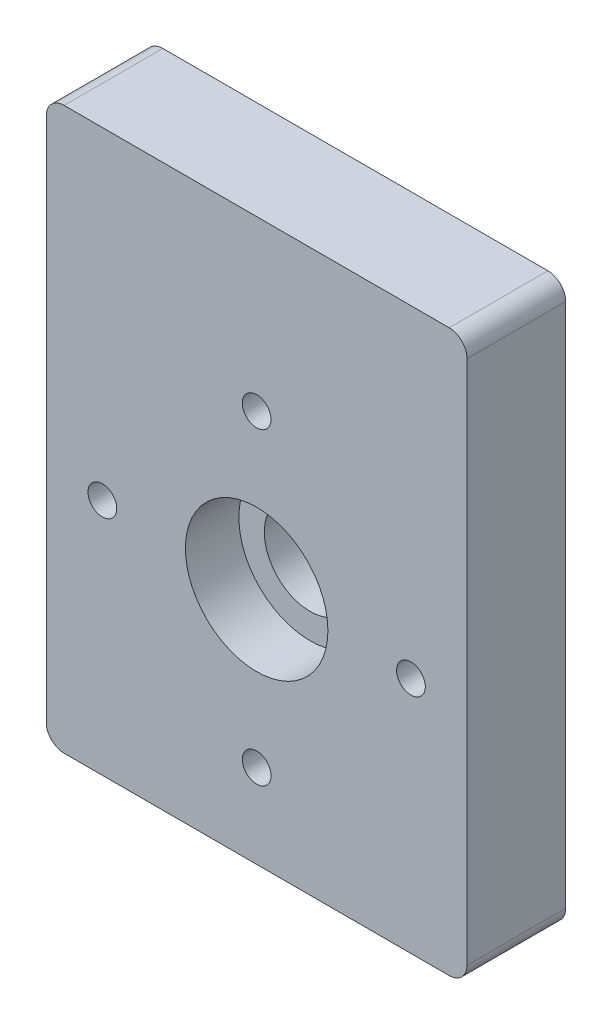
ISO-10303-21;
HEADER;
FILE_DESCRIPTION(('STEP AP214'),'2;1');
FILE_NAME('part.step','',(''),(''),'','','');
FILE_SCHEMA(('AUTOMOTIVE_DESIGN { 1 0 10303 214 1 1 1 1 }'));
ENDSEC;
DATA;
#1=APPLICATION_CONTEXT('core data for automotive mechanical design processes');
#2=APPLICATION_PROTOCOL_DEFINITION('international standard','automotive_design',2000,#1);
#3=PRODUCT_CONTEXT('',#1,'mechanical');
#4=PRODUCT('Part','Part','',(#3));
#5=PRODUCT_RELATED_PRODUCT_CATEGORY('part','',(#4));
#6=PRODUCT_DEFINITION_FORMATION('','',#4);
#7=PRODUCT_DEFINITION_CONTEXT('part definition',#1,'design');
#8=PRODUCT_DEFINITION('design','',#6,#7);
#9=PRODUCT_DEFINITION_SHAPE('','',#8);
#10=(LENGTH_UNIT() NAMED_UNIT(*) SI_UNIT(.MILLI.,.METRE.));
#11=(NAMED_UNIT(*) PLANE_ANGLE_UNIT() SI_UNIT($,.RADIAN.));
#12=(NAMED_UNIT(*) SI_UNIT($,.STERADIAN.) SOLID_ANGLE_UNIT());
#13=UNCERTAINTY_MEASURE_WITH_UNIT(LENGTH_MEASURE(1.E-05),#10,'distance_accuracy_value','');
#14=(GEOMETRIC_REPRESENTATION_CONTEXT(3) GLOBAL_UNCERTAINTY_ASSIGNED_CONTEXT((#13)) GLOBAL_UNIT_ASSIGNED_CONTEXT((#10,
#11,#12)) REPRESENTATION_CONTEXT('',''));
#15=CARTESIAN_POINT('',(0.,0.,0.));
#16=DIRECTION('',(0.,0.,1.));
#17=DIRECTION('',(1.,0.,0.));
#18=AXIS2_PLACEMENT_3D('',#15,#16,#17);
#19=CARTESIAN_POINT('',(0.,0.,7.0358));
#20=DIRECTION('',(1.,0.,0.));
#21=DIRECTION('',(0.,0.,-1.));
#22=AXIS2_PLACEMENT_3D('',#19,#20,#21);
#23=PLANE('',#22);
#24=DIRECTION('',(0.,-1.,0.));
#25=VECTOR('',#24,1.);
#26=CARTESIAN_POINT('',(0.,0.,0.));
#27=LINE('',#26,#25);
#28=CARTESIAN_POINT('',(0.,38.73,0.));
#29=VERTEX_POINT('',#28);
#30=CARTESIAN_POINT('',(0.,1.27,0.));
#31=VERTEX_POINT('',#30);
#32=EDGE_CURVE('E129',#29,#31,#27,.T.);
#33=ORIENTED_EDGE('',*,*,#32,.T.);
#34=DIRECTION('',(0.,0.,-1.));
#35=VECTOR('',#34,1.);
#36=CARTESIAN_POINT('',(0.,1.27,7.0358));
#37=LINE('',#36,#35);
#38=CARTESIAN_POINT('',(0.,1.27,7.0358));
#39=VERTEX_POINT('',#38);
#40=EDGE_CURVE('E152',#31,#39,#37,.F.);
#41=ORIENTED_EDGE('',*,*,#40,.T.);
#42=DIRECTION('',(0.,-1.,0.));
#43=VECTOR('',#42,1.);
#44=CARTESIAN_POINT('',(0.,0.,7.0358));
#45=LINE('',#44,#43);
#46=CARTESIAN_POINT('',(0.,38.73,7.0358));
#47=VERTEX_POINT('',#46);
#48=EDGE_CURVE('E127',#47,#39,#45,.T.);
#49=ORIENTED_EDGE('',*,*,#48,.F.);
#50=DIRECTION('',(0.,0.,-1.));
#51=VECTOR('',#50,1.);
#52=CARTESIAN_POINT('',(0.,38.73,7.0358));
#53=LINE('',#52,#51);
#54=EDGE_CURVE('E149',#47,#29,#53,.T.);
#55=ORIENTED_EDGE('',*,*,#54,.T.);
#56=EDGE_LOOP('',(#33,#41,#49,#55));
#57=FACE_BOUND('',#56,.T.);
#58=ADVANCED_FACE('F34',(#57),#23,.F.);
#59=CARTESIAN_POINT('',(0.,0.,7.0358));
#60=DIRECTION('',(0.,1.,0.));
#61=DIRECTION('',(0.,0.,1.));
#62=AXIS2_PLACEMENT_3D('',#59,#60,#61);
#63=PLANE('',#62);
#64=DIRECTION('',(1.,0.,0.));
#65=VECTOR('',#64,1.);
#66=CARTESIAN_POINT('',(0.,0.,0.));
#67=LINE('',#66,#65);
#68=CARTESIAN_POINT('',(1.27,0.,0.));
#69=VERTEX_POINT('',#68);
#70=CARTESIAN_POINT('',(28.73,0.,0.));
#71=VERTEX_POINT('',#70);
#72=EDGE_CURVE('E125',#69,#71,#67,.T.);
#73=ORIENTED_EDGE('',*,*,#72,.T.);
#74=DIRECTION('',(0.,0.,-1.));
#75=VECTOR('',#74,1.);
#76=CARTESIAN_POINT('',(28.73,0.,7.0358));
#77=LINE('',#76,#75);
#78=CARTESIAN_POINT('',(28.73,0.,7.0358));
#79=VERTEX_POINT('',#78);
#80=EDGE_CURVE('E104',#71,#79,#77,.F.);
#81=ORIENTED_EDGE('',*,*,#80,.T.);
#82=DIRECTION('',(1.,0.,0.));
#83=VECTOR('',#82,1.);
#84=CARTESIAN_POINT('',(0.,0.,7.0358));
#85=LINE('',#84,#83);
#86=CARTESIAN_POINT('',(1.27,0.,7.0358));
#87=VERTEX_POINT('',#86);
#88=EDGE_CURVE('E168',#87,#79,#85,.T.);
#89=ORIENTED_EDGE('',*,*,#88,.F.);
#90=DIRECTION('',(0.,0.,-1.));
#91=VECTOR('',#90,1.);
#92=CARTESIAN_POINT('',(1.27,0.,7.0358));
#93=LINE('',#92,#91);
#94=EDGE_CURVE('E109',#87,#69,#93,.T.);
#95=ORIENTED_EDGE('',*,*,#94,.T.);
#96=EDGE_LOOP('',(#73,#81,#89,#95));
#97=FACE_BOUND('',#96,.T.);
#98=ADVANCED_FACE('F231',(#97),#63,.F.);
#99=CARTESIAN_POINT('',(30.,0.,7.0358));
#100=DIRECTION('',(-1.,0.,0.));
#101=DIRECTION('',(0.,0.,1.));
#102=AXIS2_PLACEMENT_3D('',#99,#100,#101);
#103=PLANE('',#102);
#104=DIRECTION('',(0.,1.,0.));
#105=VECTOR('',#104,1.);
#106=CARTESIAN_POINT('',(30.,0.,7.0358));
#107=LINE('',#106,#105);
#108=CARTESIAN_POINT('',(30.,1.27,7.0358));
#109=VERTEX_POINT('',#108);
#110=CARTESIAN_POINT('',(30.,38.73,7.0358));
#111=VERTEX_POINT('',#110);
#112=EDGE_CURVE('E118',#109,#111,#107,.T.);
#113=ORIENTED_EDGE('',*,*,#112,.F.);
#114=DIRECTION('',(0.,0.,-1.));
#115=VECTOR('',#114,1.);
#116=CARTESIAN_POINT('',(30.,1.27,7.0358));
#117=LINE('',#116,#115);
#118=CARTESIAN_POINT('',(30.,1.27,0.));
#119=VERTEX_POINT('',#118);
#120=EDGE_CURVE('E103',#109,#119,#117,.T.);
#121=ORIENTED_EDGE('',*,*,#120,.T.);
#122=DIRECTION('',(0.,1.,0.));
#123=VECTOR('',#122,1.);
#124=CARTESIAN_POINT('',(30.,0.,0.));
#125=LINE('',#124,#123);
#126=CARTESIAN_POINT('',(30.,38.73,0.));
#127=VERTEX_POINT('',#126);
#128=EDGE_CURVE('E116',#119,#127,#125,.T.);
#129=ORIENTED_EDGE('',*,*,#128,.T.);
#130=DIRECTION('',(0.,0.,-1.));
#131=VECTOR('',#130,1.);
#132=CARTESIAN_POINT('',(30.,38.73,7.0358));
#133=LINE('',#132,#131);
#134=EDGE_CURVE('E120',#127,#111,#133,.F.);
#135=ORIENTED_EDGE('',*,*,#134,.T.);
#136=EDGE_LOOP('',(#113,#121,#129,#135));
#137=FACE_BOUND('',#136,.T.);
#138=ADVANCED_FACE('F115',(#137),#103,.F.);
#139=CARTESIAN_POINT('',(0.,40.,7.0358));
#140=DIRECTION('',(0.,-1.,0.));
#141=DIRECTION('',(0.,0.,-1.));
#142=AXIS2_PLACEMENT_3D('',#139,#140,#141);
#143=PLANE('',#142);
#144=DIRECTION('',(-1.,0.,0.));
#145=VECTOR('',#144,1.);
#146=CARTESIAN_POINT('',(0.,40.,0.));
#147=LINE('',#146,#145);
#148=CARTESIAN_POINT('',(28.73,40.,0.));
#149=VERTEX_POINT('',#148);
#150=CARTESIAN_POINT('',(1.27,40.,0.));
#151=VERTEX_POINT('',#150);
#152=EDGE_CURVE('E124',#149,#151,#147,.T.);
#153=ORIENTED_EDGE('',*,*,#152,.T.);
#154=DIRECTION('',(0.,0.,-1.));
#155=VECTOR('',#154,1.);
#156=CARTESIAN_POINT('',(1.27,40.,7.0358));
#157=LINE('',#156,#155);
#158=CARTESIAN_POINT('',(1.27,40.,7.0358));
#159=VERTEX_POINT('',#158);
#160=EDGE_CURVE('E11',#151,#159,#157,.F.);
#161=ORIENTED_EDGE('',*,*,#160,.T.);
#162=DIRECTION('',(-1.,0.,0.));
#163=VECTOR('',#162,1.);
#164=CARTESIAN_POINT('',(0.,40.,7.0358));
#165=LINE('',#164,#163);
#166=CARTESIAN_POINT('',(28.73,40.,7.0358));
#167=VERTEX_POINT('',#166);
#168=EDGE_CURVE('E133',#167,#159,#165,.T.);
#169=ORIENTED_EDGE('',*,*,#168,.F.);
#170=DIRECTION('',(0.,0.,-1.));
#171=VECTOR('',#170,1.);
#172=CARTESIAN_POINT('',(28.73,40.,7.0358));
#173=LINE('',#172,#171);
#174=EDGE_CURVE('E42',#167,#149,#173,.T.);
#175=ORIENTED_EDGE('',*,*,#174,.T.);
#176=EDGE_LOOP('',(#153,#161,#169,#175));
#177=FACE_BOUND('',#176,.T.);
#178=ADVANCED_FACE('F155',(#177),#143,.F.);
#179=CARTESIAN_POINT('',(0.,0.,7.0358));
#180=DIRECTION('',(0.,0.,-1.));
#181=DIRECTION('',(-1.,0.,0.));
#182=AXIS2_PLACEMENT_3D('',#179,#180,#181);
#183=PLANE('',#182);
#184=CARTESIAN_POINT('',(15.,16.98,7.0358));
#185=DIRECTION('',(0.,0.,1.));
#186=DIRECTION('',(1.,0.,0.));
#187=AXIS2_PLACEMENT_3D('',#184,#185,#186);
#188=CIRCLE('',#187,5.08);
#189=CARTESIAN_POINT('',(20.08,16.98,7.0358));
#190=VERTEX_POINT('',#189);
#191=EDGE_CURVE('E212',#190,#190,#188,.T.);
#192=ORIENTED_EDGE('',*,*,#191,.F.);
#193=EDGE_LOOP('',(#192));
#194=FACE_BOUND('',#193,.T.);
#195=CARTESIAN_POINT('',(15.,27.98,7.0358));
#196=DIRECTION('',(0.,0.,1.));
#197=DIRECTION('',(1.,0.,0.));
#198=AXIS2_PLACEMENT_3D('',#195,#196,#197);
#199=CIRCLE('',#198,1.025);
#200=CARTESIAN_POINT('',(16.025,27.98,7.0358));
#201=VERTEX_POINT('',#200);
#202=EDGE_CURVE('E200',#201,#201,#199,.T.);
#203=ORIENTED_EDGE('',*,*,#202,.F.);
#204=EDGE_LOOP('',(#203));
#205=FACE_BOUND('',#204,.T.);
#206=CARTESIAN_POINT('',(26.,16.98,7.0358));
#207=DIRECTION('',(0.,0.,1.));
#208=DIRECTION('',(1.,0.,0.));
#209=AXIS2_PLACEMENT_3D('',#206,#207,#208);
#210=CIRCLE('',#209,1.025);
#211=CARTESIAN_POINT('',(27.025,16.98,7.0358));
#212=VERTEX_POINT('',#211);
#213=EDGE_CURVE('E194',#212,#212,#210,.T.);
#214=ORIENTED_EDGE('',*,*,#213,.F.);
#215=EDGE_LOOP('',(#214));
#216=FACE_BOUND('',#215,.T.);
#217=CARTESIAN_POINT('',(15.,5.98,7.0358));
#218=DIRECTION('',(0.,0.,1.));
#219=DIRECTION('',(1.,0.,0.));
#220=AXIS2_PLACEMENT_3D('',#217,#218,#219);
#221=CIRCLE('',#220,1.025);
#222=CARTESIAN_POINT('',(16.025,5.98,7.0358));
#223=VERTEX_POINT('',#222);
#224=EDGE_CURVE('E186',#223,#223,#221,.T.);
#225=ORIENTED_EDGE('',*,*,#224,.F.);
#226=EDGE_LOOP('',(#225));
#227=FACE_BOUND('',#226,.T.);
#228=CARTESIAN_POINT('',(4.,16.98,7.0358));
#229=DIRECTION('',(0.,0.,1.));
#230=DIRECTION('',(1.,0.,0.));
#231=AXIS2_PLACEMENT_3D('',#228,#229,#230);
#232=CIRCLE('',#231,1.025);
#233=CARTESIAN_POINT('',(5.025,16.98,7.0358));
#234=VERTEX_POINT('',#233);
#235=EDGE_CURVE('E178',#234,#234,#232,.T.);
#236=ORIENTED_EDGE('',*,*,#235,.F.);
#237=EDGE_LOOP('',(#236));
#238=FACE_BOUND('',#237,.T.);
#239=ORIENTED_EDGE('',*,*,#88,.T.);
#240=CARTESIAN_POINT('',(28.73,1.27,7.0358));
#241=DIRECTION('',(0.,0.,-1.));
#242=DIRECTION('',(-1.,0.,0.));
#243=AXIS2_PLACEMENT_3D('',#240,#241,#242);
#244=CIRCLE('',#243,1.27);
#245=EDGE_CURVE('E147',#79,#109,#244,.F.);
#246=ORIENTED_EDGE('',*,*,#245,.T.);
#247=ORIENTED_EDGE('',*,*,#112,.T.);
#248=CARTESIAN_POINT('',(28.73,38.73,7.0358));
#249=DIRECTION('',(0.,0.,-1.));
#250=DIRECTION('',(-1.,0.,0.));
#251=AXIS2_PLACEMENT_3D('',#248,#249,#250);
#252=CIRCLE('',#251,1.27);
#253=EDGE_CURVE('E54',#111,#167,#252,.F.);
#254=ORIENTED_EDGE('',*,*,#253,.T.);
#255=ORIENTED_EDGE('',*,*,#168,.T.);
#256=CARTESIAN_POINT('',(1.27,38.73,7.0358));
#257=DIRECTION('',(0.,0.,-1.));
#258=DIRECTION('',(-1.,0.,0.));
#259=AXIS2_PLACEMENT_3D('',#256,#257,#258);
#260=CIRCLE('',#259,1.27);
#261=EDGE_CURVE('E143',#159,#47,#260,.F.);
#262=ORIENTED_EDGE('',*,*,#261,.T.);
#263=ORIENTED_EDGE('',*,*,#48,.T.);
#264=CARTESIAN_POINT('',(1.27,1.27,7.0358));
#265=DIRECTION('',(0.,0.,-1.));
#266=DIRECTION('',(-1.,0.,0.));
#267=AXIS2_PLACEMENT_3D('',#264,#265,#266);
#268=CIRCLE('',#267,1.27);
#269=EDGE_CURVE('E145',#39,#87,#268,.F.);
#270=ORIENTED_EDGE('',*,*,#269,.T.);
#271=EDGE_LOOP('',(#239,#246,#247,#254,#255,#262,#263,#270));
#272=FACE_BOUND('',#271,.T.);
#273=ADVANCED_FACE('F218',(#194,#205,#216,#227,#238,#272),#183,.F.);
#274=CARTESIAN_POINT('',(0.,0.,0.));
#275=DIRECTION('',(0.,0.,-1.));
#276=DIRECTION('',(-1.,0.,0.));
#277=AXIS2_PLACEMENT_3D('',#274,#275,#276);
#278=PLANE('',#277);
#279=CARTESIAN_POINT('',(15.,16.98,0.));
#280=DIRECTION('',(0.,0.,1.));
#281=DIRECTION('',(1.,0.,0.));
#282=AXIS2_PLACEMENT_3D('',#279,#280,#281);
#283=CIRCLE('',#282,3.2639);
#284=CARTESIAN_POINT('',(18.2639,16.98,0.));
#285=VERTEX_POINT('',#284);
#286=EDGE_CURVE('E203',#285,#285,#283,.T.);
#287=ORIENTED_EDGE('',*,*,#286,.T.);
#288=EDGE_LOOP('',(#287));
#289=FACE_BOUND('',#288,.T.);
#290=CARTESIAN_POINT('',(15.,27.98,0.));
#291=DIRECTION('',(0.,0.,1.));
#292=DIRECTION('',(1.,0.,0.));
#293=AXIS2_PLACEMENT_3D('',#290,#291,#292);
#294=CIRCLE('',#293,1.025);
#295=CARTESIAN_POINT('',(16.025,27.98,0.));
#296=VERTEX_POINT('',#295);
#297=EDGE_CURVE('E197',#296,#296,#294,.T.);
#298=ORIENTED_EDGE('',*,*,#297,.T.);
#299=EDGE_LOOP('',(#298));
#300=FACE_BOUND('',#299,.T.);
#301=CARTESIAN_POINT('',(26.,16.98,0.));
#302=DIRECTION('',(0.,0.,1.));
#303=DIRECTION('',(1.,0.,0.));
#304=AXIS2_PLACEMENT_3D('',#301,#302,#303);
#305=CIRCLE('',#304,1.025);
#306=CARTESIAN_POINT('',(27.025,16.98,0.));
#307=VERTEX_POINT('',#306);
#308=EDGE_CURVE('E191',#307,#307,#305,.T.);
#309=ORIENTED_EDGE('',*,*,#308,.T.);
#310=EDGE_LOOP('',(#309));
#311=FACE_BOUND('',#310,.T.);
#312=CARTESIAN_POINT('',(15.,5.98,0.));
#313=DIRECTION('',(0.,0.,1.));
#314=DIRECTION('',(1.,0.,0.));
#315=AXIS2_PLACEMENT_3D('',#312,#313,#314);
#316=CIRCLE('',#315,1.025);
#317=CARTESIAN_POINT('',(16.025,5.98,0.));
#318=VERTEX_POINT('',#317);
#319=EDGE_CURVE('E182',#318,#318,#316,.T.);
#320=ORIENTED_EDGE('',*,*,#319,.T.);
#321=EDGE_LOOP('',(#320));
#322=FACE_BOUND('',#321,.T.);
#323=CARTESIAN_POINT('',(4.,16.98,0.));
#324=DIRECTION('',(0.,0.,1.));
#325=DIRECTION('',(1.,0.,0.));
#326=AXIS2_PLACEMENT_3D('',#323,#324,#325);
#327=CIRCLE('',#326,1.025);
#328=CARTESIAN_POINT('',(5.025,16.98,0.));
#329=VERTEX_POINT('',#328);
#330=EDGE_CURVE('E173',#329,#329,#327,.T.);
#331=ORIENTED_EDGE('',*,*,#330,.T.);
#332=EDGE_LOOP('',(#331));
#333=FACE_BOUND('',#332,.T.);
#334=ORIENTED_EDGE('',*,*,#128,.F.);
#335=CARTESIAN_POINT('',(28.73,1.27,0.));
#336=DIRECTION('',(0.,0.,-1.));
#337=DIRECTION('',(-1.,0.,0.));
#338=AXIS2_PLACEMENT_3D('',#335,#336,#337);
#339=CIRCLE('',#338,1.27);
#340=EDGE_CURVE('E99',#119,#71,#339,.T.);
#341=ORIENTED_EDGE('',*,*,#340,.T.);
#342=ORIENTED_EDGE('',*,*,#72,.F.);
#343=CARTESIAN_POINT('',(1.27,1.27,0.));
#344=DIRECTION('',(0.,0.,-1.));
#345=DIRECTION('',(-1.,0.,0.));
#346=AXIS2_PLACEMENT_3D('',#343,#344,#345);
#347=CIRCLE('',#346,1.27);
#348=EDGE_CURVE('E110',#69,#31,#347,.T.);
#349=ORIENTED_EDGE('',*,*,#348,.T.);
#350=ORIENTED_EDGE('',*,*,#32,.F.);
#351=CARTESIAN_POINT('',(1.27,38.73,0.));
#352=DIRECTION('',(0.,0.,-1.));
#353=DIRECTION('',(-1.,0.,0.));
#354=AXIS2_PLACEMENT_3D('',#351,#352,#353);
#355=CIRCLE('',#354,1.27);
#356=EDGE_CURVE('E136',#29,#151,#355,.T.);
#357=ORIENTED_EDGE('',*,*,#356,.T.);
#358=ORIENTED_EDGE('',*,*,#152,.F.);
#359=CARTESIAN_POINT('',(28.73,38.73,0.));
#360=DIRECTION('',(0.,0.,-1.));
#361=DIRECTION('',(-1.,0.,0.));
#362=AXIS2_PLACEMENT_3D('',#359,#360,#361);
#363=CIRCLE('',#362,1.27);
#364=EDGE_CURVE('E119',#149,#127,#363,.T.);
#365=ORIENTED_EDGE('',*,*,#364,.T.);
#366=EDGE_LOOP('',(#334,#341,#342,#349,#350,#357,#358,#365));
#367=FACE_BOUND('',#366,.T.);
#368=ADVANCED_FACE('F122',(#289,#300,#311,#322,#333,#367),#278,.T.);
#369=CARTESIAN_POINT('',(4.,16.98,7.0358));
#370=DIRECTION('',(0.,0.,1.));
#371=DIRECTION('',(1.,0.,0.));
#372=AXIS2_PLACEMENT_3D('',#369,#370,#371);
#373=CYLINDRICAL_SURFACE('',#372,1.025);
#374=ORIENTED_EDGE('',*,*,#330,.F.);
#375=EDGE_LOOP('',(#374));
#376=FACE_BOUND('',#375,.T.);
#377=ORIENTED_EDGE('',*,*,#235,.T.);
#378=EDGE_LOOP('',(#377));
#379=FACE_BOUND('',#378,.T.);
#380=ADVANCED_FACE('F253',(#376,#379),#373,.F.);
#381=CARTESIAN_POINT('',(15.,5.98,7.0358));
#382=DIRECTION('',(0.,0.,1.));
#383=DIRECTION('',(1.,0.,0.));
#384=AXIS2_PLACEMENT_3D('',#381,#382,#383);
#385=CYLINDRICAL_SURFACE('',#384,1.025);
#386=ORIENTED_EDGE('',*,*,#319,.F.);
#387=EDGE_LOOP('',(#386));
#388=FACE_BOUND('',#387,.T.);
#389=ORIENTED_EDGE('',*,*,#224,.T.);
#390=EDGE_LOOP('',(#389));
#391=FACE_BOUND('',#390,.T.);
#392=ADVANCED_FACE('F258',(#388,#391),#385,.F.);
#393=CARTESIAN_POINT('',(26.,16.98,7.0358));
#394=DIRECTION('',(0.,0.,1.));
#395=DIRECTION('',(1.,0.,0.));
#396=AXIS2_PLACEMENT_3D('',#393,#394,#395);
#397=CYLINDRICAL_SURFACE('',#396,1.025);
#398=ORIENTED_EDGE('',*,*,#308,.F.);
#399=EDGE_LOOP('',(#398));
#400=FACE_BOUND('',#399,.T.);
#401=ORIENTED_EDGE('',*,*,#213,.T.);
#402=EDGE_LOOP('',(#401));
#403=FACE_BOUND('',#402,.T.);
#404=ADVANCED_FACE('F262',(#400,#403),#397,.F.);
#405=CARTESIAN_POINT('',(15.,27.98,7.0358));
#406=DIRECTION('',(0.,0.,1.));
#407=DIRECTION('',(1.,0.,0.));
#408=AXIS2_PLACEMENT_3D('',#405,#406,#407);
#409=CYLINDRICAL_SURFACE('',#408,1.025);
#410=ORIENTED_EDGE('',*,*,#297,.F.);
#411=EDGE_LOOP('',(#410));
#412=FACE_BOUND('',#411,.T.);
#413=ORIENTED_EDGE('',*,*,#202,.T.);
#414=EDGE_LOOP('',(#413));
#415=FACE_BOUND('',#414,.T.);
#416=ADVANCED_FACE('F266',(#412,#415),#409,.F.);
#417=CARTESIAN_POINT('',(15.,16.98,7.0358));
#418=DIRECTION('',(0.,0.,1.));
#419=DIRECTION('',(1.,0.,0.));
#420=AXIS2_PLACEMENT_3D('',#417,#418,#419);
#421=CYLINDRICAL_SURFACE('',#420,3.2639);
#422=ORIENTED_EDGE('',*,*,#286,.F.);
#423=EDGE_LOOP('',(#422));
#424=FACE_BOUND('',#423,.T.);
#425=CARTESIAN_POINT('',(15.,16.98,3.2258));
#426=DIRECTION('',(0.,0.,1.));
#427=DIRECTION('',(1.,0.,0.));
#428=AXIS2_PLACEMENT_3D('',#425,#426,#427);
#429=CIRCLE('',#428,3.2639);
#430=CARTESIAN_POINT('',(18.2639,16.98,3.2258));
#431=VERTEX_POINT('',#430);
#432=EDGE_CURVE('E206',#431,#431,#429,.T.);
#433=ORIENTED_EDGE('',*,*,#432,.T.);
#434=EDGE_LOOP('',(#433));
#435=FACE_BOUND('',#434,.T.);
#436=ADVANCED_FACE('F270',(#424,#435),#421,.F.);
#437=CARTESIAN_POINT('',(18.2639,16.98,3.2258));
#438=DIRECTION('',(0.,0.,-1.));
#439=DIRECTION('',(-1.,0.,0.));
#440=AXIS2_PLACEMENT_3D('',#437,#438,#439);
#441=PLANE('',#440);
#442=ORIENTED_EDGE('',*,*,#432,.F.);
#443=EDGE_LOOP('',(#442));
#444=FACE_BOUND('',#443,.T.);
#445=CARTESIAN_POINT('',(15.,16.98,3.2258));
#446=DIRECTION('',(0.,0.,1.));
#447=DIRECTION('',(1.,0.,0.));
#448=AXIS2_PLACEMENT_3D('',#445,#446,#447);
#449=CIRCLE('',#448,5.08);
#450=CARTESIAN_POINT('',(20.08,16.98,3.2258));
#451=VERTEX_POINT('',#450);
#452=EDGE_CURVE('E209',#451,#451,#449,.T.);
#453=ORIENTED_EDGE('',*,*,#452,.T.);
#454=EDGE_LOOP('',(#453));
#455=FACE_BOUND('',#454,.T.);
#456=ADVANCED_FACE('F274',(#444,#455),#441,.F.);
#457=CARTESIAN_POINT('',(15.,16.98,7.0358));
#458=DIRECTION('',(0.,0.,1.));
#459=DIRECTION('',(1.,0.,0.));
#460=AXIS2_PLACEMENT_3D('',#457,#458,#459);
#461=CYLINDRICAL_SURFACE('',#460,5.08);
#462=ORIENTED_EDGE('',*,*,#452,.F.);
#463=EDGE_LOOP('',(#462));
#464=FACE_BOUND('',#463,.T.);
#465=ORIENTED_EDGE('',*,*,#191,.T.);
#466=EDGE_LOOP('',(#465));
#467=FACE_BOUND('',#466,.T.);
#468=ADVANCED_FACE('F216',(#464,#467),#461,.F.);
#469=CARTESIAN_POINT('',(28.73,1.27,7.0358));
#470=DIRECTION('',(0.,0.,-1.));
#471=DIRECTION('',(-1.,0.,0.));
#472=AXIS2_PLACEMENT_3D('',#469,#470,#471);
#473=CYLINDRICAL_SURFACE('',#472,1.27);
#474=ORIENTED_EDGE('',*,*,#245,.F.);
#475=ORIENTED_EDGE('',*,*,#80,.F.);
#476=ORIENTED_EDGE('',*,*,#340,.F.);
#477=ORIENTED_EDGE('',*,*,#120,.F.);
#478=EDGE_LOOP('',(#474,#475,#476,#477));
#479=FACE_BOUND('',#478,.T.);
#480=ADVANCED_FACE('F102',(#479),#473,.T.);
#481=CARTESIAN_POINT('',(1.27,1.27,7.0358));
#482=DIRECTION('',(0.,0.,-1.));
#483=DIRECTION('',(-1.,0.,0.));
#484=AXIS2_PLACEMENT_3D('',#481,#482,#483);
#485=CYLINDRICAL_SURFACE('',#484,1.27);
#486=ORIENTED_EDGE('',*,*,#269,.F.);
#487=ORIENTED_EDGE('',*,*,#40,.F.);
#488=ORIENTED_EDGE('',*,*,#348,.F.);
#489=ORIENTED_EDGE('',*,*,#94,.F.);
#490=EDGE_LOOP('',(#486,#487,#488,#489));
#491=FACE_BOUND('',#490,.T.);
#492=ADVANCED_FACE('F233',(#491),#485,.T.);
#493=CARTESIAN_POINT('',(1.27,38.73,7.0358));
#494=DIRECTION('',(0.,0.,-1.));
#495=DIRECTION('',(-1.,0.,0.));
#496=AXIS2_PLACEMENT_3D('',#493,#494,#495);
#497=CYLINDRICAL_SURFACE('',#496,1.27);
#498=ORIENTED_EDGE('',*,*,#261,.F.);
#499=ORIENTED_EDGE('',*,*,#160,.F.);
#500=ORIENTED_EDGE('',*,*,#356,.F.);
#501=ORIENTED_EDGE('',*,*,#54,.F.);
#502=EDGE_LOOP('',(#498,#499,#500,#501));
#503=FACE_BOUND('',#502,.T.);
#504=ADVANCED_FACE('F162',(#503),#497,.T.);
#505=CARTESIAN_POINT('',(28.73,38.73,7.0358));
#506=DIRECTION('',(0.,0.,-1.));
#507=DIRECTION('',(-1.,0.,0.));
#508=AXIS2_PLACEMENT_3D('',#505,#506,#507);
#509=CYLINDRICAL_SURFACE('',#508,1.27);
#510=ORIENTED_EDGE('',*,*,#253,.F.);
#511=ORIENTED_EDGE('',*,*,#134,.F.);
#512=ORIENTED_EDGE('',*,*,#364,.F.);
#513=ORIENTED_EDGE('',*,*,#174,.F.);
#514=EDGE_LOOP('',(#510,#511,#512,#513));
#515=FACE_BOUND('',#514,.T.);
#516=ADVANCED_FACE('F36',(#515),#509,.T.);
#517=CLOSED_SHELL('',(#58,#98,#138,#178,#273,#368,#380,#392,#404,#416,#436,#456,#468,#480,#492,
#504,#516));
#518=MANIFOLD_SOLID_BREP('B2',#517);
#519=ADVANCED_BREP_SHAPE_REPRESENTATION('',(#18,#518),#14);
#520=SHAPE_DEFINITION_REPRESENTATION(#9,#519);
ENDSEC;
END-ISO-10303-21;
